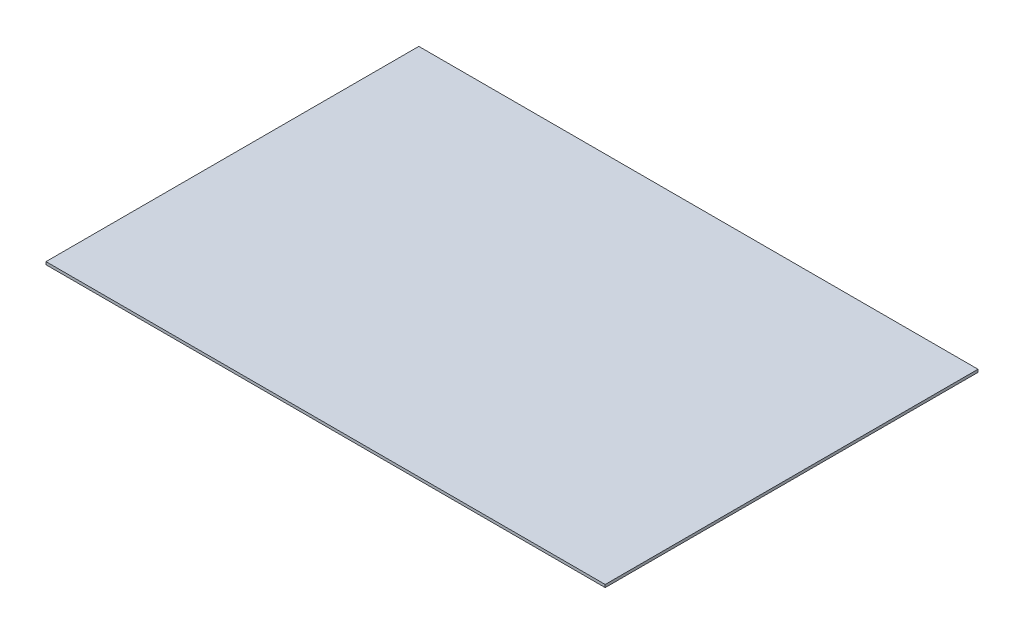
ISO-10303-21;
HEADER;
FILE_DESCRIPTION(('STEP AP214'),'2;1');
FILE_NAME('part.step','',(''),(''),'','','');
FILE_SCHEMA(('AUTOMOTIVE_DESIGN { 1 0 10303 214 1 1 1 1 }'));
ENDSEC;
DATA;
#1=APPLICATION_CONTEXT('core data for automotive mechanical design processes');
#2=APPLICATION_PROTOCOL_DEFINITION('international standard','automotive_design',2000,#1);
#3=PRODUCT_CONTEXT('',#1,'mechanical');
#4=PRODUCT('Part','Part','',(#3));
#5=PRODUCT_RELATED_PRODUCT_CATEGORY('part','',(#4));
#6=PRODUCT_DEFINITION_FORMATION('','',#4);
#7=PRODUCT_DEFINITION_CONTEXT('part definition',#1,'design');
#8=PRODUCT_DEFINITION('design','',#6,#7);
#9=PRODUCT_DEFINITION_SHAPE('','',#8);
#10=(LENGTH_UNIT() NAMED_UNIT(*) SI_UNIT(.MILLI.,.METRE.));
#11=(NAMED_UNIT(*) PLANE_ANGLE_UNIT() SI_UNIT($,.RADIAN.));
#12=(NAMED_UNIT(*) SI_UNIT($,.STERADIAN.) SOLID_ANGLE_UNIT());
#13=UNCERTAINTY_MEASURE_WITH_UNIT(LENGTH_MEASURE(1.E-05),#10,'distance_accuracy_value','');
#14=(GEOMETRIC_REPRESENTATION_CONTEXT(3) GLOBAL_UNCERTAINTY_ASSIGNED_CONTEXT((#13)) GLOBAL_UNIT_ASSIGNED_CONTEXT((#10,
#11,#12)) REPRESENTATION_CONTEXT('',''));
#15=CARTESIAN_POINT('',(0.,0.,0.));
#16=DIRECTION('',(0.,0.,1.));
#17=DIRECTION('',(1.,0.,0.));
#18=AXIS2_PLACEMENT_3D('',#15,#16,#17);
#19=CARTESIAN_POINT('',(152.4,1.5,101.6));
#20=DIRECTION('',(-1.,0.,0.));
#21=DIRECTION('',(0.,0.,1.));
#22=AXIS2_PLACEMENT_3D('',#19,#20,#21);
#23=PLANE('',#22);
#24=DIRECTION('',(0.,0.,-1.));
#25=VECTOR('',#24,1.);
#26=CARTESIAN_POINT('',(152.4,0.,101.6));
#27=LINE('',#26,#25);
#28=CARTESIAN_POINT('',(152.4,0.,101.6));
#29=VERTEX_POINT('',#28);
#30=CARTESIAN_POINT('',(152.4,0.,-101.6));
#31=VERTEX_POINT('',#30);
#32=EDGE_CURVE('E98',#29,#31,#27,.T.);
#33=ORIENTED_EDGE('',*,*,#32,.T.);
#34=DIRECTION('',(0.,-1.,0.));
#35=VECTOR('',#34,1.);
#36=CARTESIAN_POINT('',(152.4,1.5,-101.6));
#37=LINE('',#36,#35);
#38=CARTESIAN_POINT('',(152.4,1.5,-101.6));
#39=VERTEX_POINT('',#38);
#40=EDGE_CURVE('E11',#39,#31,#37,.T.);
#41=ORIENTED_EDGE('',*,*,#40,.F.);
#42=DIRECTION('',(0.,0.,-1.));
#43=VECTOR('',#42,1.);
#44=CARTESIAN_POINT('',(152.4,1.5,101.6));
#45=LINE('',#44,#43);
#46=CARTESIAN_POINT('',(152.4,1.5,101.6));
#47=VERTEX_POINT('',#46);
#48=EDGE_CURVE('E86',#47,#39,#45,.T.);
#49=ORIENTED_EDGE('',*,*,#48,.F.);
#50=DIRECTION('',(0.,-1.,0.));
#51=VECTOR('',#50,1.);
#52=CARTESIAN_POINT('',(152.4,1.5,101.6));
#53=LINE('',#52,#51);
#54=EDGE_CURVE('E94',#47,#29,#53,.T.);
#55=ORIENTED_EDGE('',*,*,#54,.T.);
#56=EDGE_LOOP('',(#33,#41,#49,#55));
#57=FACE_BOUND('',#56,.T.);
#58=ADVANCED_FACE('F35',(#57),#23,.F.);
#59=CARTESIAN_POINT('',(-152.4,1.5,-101.6));
#60=DIRECTION('',(0.,0.,1.));
#61=DIRECTION('',(1.,0.,0.));
#62=AXIS2_PLACEMENT_3D('',#59,#60,#61);
#63=PLANE('',#62);
#64=DIRECTION('',(-1.,0.,0.));
#65=VECTOR('',#64,1.);
#66=CARTESIAN_POINT('',(-152.4,0.,-101.6));
#67=LINE('',#66,#65);
#68=CARTESIAN_POINT('',(-152.4,0.,-101.6));
#69=VERTEX_POINT('',#68);
#70=EDGE_CURVE('E90',#31,#69,#67,.T.);
#71=ORIENTED_EDGE('',*,*,#70,.T.);
#72=DIRECTION('',(0.,-1.,0.));
#73=VECTOR('',#72,1.);
#74=CARTESIAN_POINT('',(-152.4,1.5,-101.6));
#75=LINE('',#74,#73);
#76=CARTESIAN_POINT('',(-152.4,1.5,-101.6));
#77=VERTEX_POINT('',#76);
#78=EDGE_CURVE('E43',#77,#69,#75,.T.);
#79=ORIENTED_EDGE('',*,*,#78,.F.);
#80=DIRECTION('',(-1.,0.,0.));
#81=VECTOR('',#80,1.);
#82=CARTESIAN_POINT('',(-152.4,1.5,-101.6));
#83=LINE('',#82,#81);
#84=EDGE_CURVE('E81',#39,#77,#83,.T.);
#85=ORIENTED_EDGE('',*,*,#84,.F.);
#86=ORIENTED_EDGE('',*,*,#40,.T.);
#87=EDGE_LOOP('',(#71,#79,#85,#86));
#88=FACE_BOUND('',#87,.T.);
#89=ADVANCED_FACE('F89',(#88),#63,.F.);
#90=CARTESIAN_POINT('',(-152.4,1.5,101.6));
#91=DIRECTION('',(1.,0.,0.));
#92=DIRECTION('',(0.,0.,-1.));
#93=AXIS2_PLACEMENT_3D('',#90,#91,#92);
#94=PLANE('',#93);
#95=DIRECTION('',(0.,0.,1.));
#96=VECTOR('',#95,1.);
#97=CARTESIAN_POINT('',(-152.4,0.,101.6));
#98=LINE('',#97,#96);
#99=CARTESIAN_POINT('',(-152.4,0.,101.6));
#100=VERTEX_POINT('',#99);
#101=EDGE_CURVE('E68',#69,#100,#98,.T.);
#102=ORIENTED_EDGE('',*,*,#101,.T.);
#103=DIRECTION('',(0.,-1.,0.));
#104=VECTOR('',#103,1.);
#105=CARTESIAN_POINT('',(-152.4,1.5,101.6));
#106=LINE('',#105,#104);
#107=CARTESIAN_POINT('',(-152.4,1.5,101.6));
#108=VERTEX_POINT('',#107);
#109=EDGE_CURVE('E91',#108,#100,#106,.T.);
#110=ORIENTED_EDGE('',*,*,#109,.F.);
#111=DIRECTION('',(0.,0.,1.));
#112=VECTOR('',#111,1.);
#113=CARTESIAN_POINT('',(-152.4,1.5,101.6));
#114=LINE('',#113,#112);
#115=EDGE_CURVE('E84',#77,#108,#114,.T.);
#116=ORIENTED_EDGE('',*,*,#115,.F.);
#117=ORIENTED_EDGE('',*,*,#78,.T.);
#118=EDGE_LOOP('',(#102,#110,#116,#117));
#119=FACE_BOUND('',#118,.T.);
#120=ADVANCED_FACE('F92',(#119),#94,.F.);
#121=CARTESIAN_POINT('',(-152.4,1.5,101.6));
#122=DIRECTION('',(0.,0.,-1.));
#123=DIRECTION('',(-1.,0.,0.));
#124=AXIS2_PLACEMENT_3D('',#121,#122,#123);
#125=PLANE('',#124);
#126=DIRECTION('',(1.,0.,0.));
#127=VECTOR('',#126,1.);
#128=CARTESIAN_POINT('',(-152.4,0.,101.6));
#129=LINE('',#128,#127);
#130=EDGE_CURVE('E74',#100,#29,#129,.T.);
#131=ORIENTED_EDGE('',*,*,#130,.T.);
#132=ORIENTED_EDGE('',*,*,#54,.F.);
#133=DIRECTION('',(1.,0.,0.));
#134=VECTOR('',#133,1.);
#135=CARTESIAN_POINT('',(-152.4,1.5,101.6));
#136=LINE('',#135,#134);
#137=EDGE_CURVE('E51',#108,#47,#136,.T.);
#138=ORIENTED_EDGE('',*,*,#137,.F.);
#139=ORIENTED_EDGE('',*,*,#109,.T.);
#140=EDGE_LOOP('',(#131,#132,#138,#139));
#141=FACE_BOUND('',#140,.T.);
#142=ADVANCED_FACE('F105',(#141),#125,.F.);
#143=CARTESIAN_POINT('',(0.,1.5,0.));
#144=DIRECTION('',(0.,-1.,0.));
#145=DIRECTION('',(0.,0.,-1.));
#146=AXIS2_PLACEMENT_3D('',#143,#144,#145);
#147=PLANE('',#146);
#148=ORIENTED_EDGE('',*,*,#48,.T.);
#149=ORIENTED_EDGE('',*,*,#84,.T.);
#150=ORIENTED_EDGE('',*,*,#115,.T.);
#151=ORIENTED_EDGE('',*,*,#137,.T.);
#152=EDGE_LOOP('',(#148,#149,#150,#151));
#153=FACE_BOUND('',#152,.T.);
#154=ADVANCED_FACE('F82',(#153),#147,.F.);
#155=CARTESIAN_POINT('',(0.,0.,0.));
#156=DIRECTION('',(0.,-1.,0.));
#157=DIRECTION('',(0.,0.,-1.));
#158=AXIS2_PLACEMENT_3D('',#155,#156,#157);
#159=PLANE('',#158);
#160=ORIENTED_EDGE('',*,*,#32,.F.);
#161=ORIENTED_EDGE('',*,*,#130,.F.);
#162=ORIENTED_EDGE('',*,*,#101,.F.);
#163=ORIENTED_EDGE('',*,*,#70,.F.);
#164=EDGE_LOOP('',(#160,#161,#162,#163));
#165=FACE_BOUND('',#164,.T.);
#166=ADVANCED_FACE('F108',(#165),#159,.T.);
#167=CLOSED_SHELL('',(#58,#89,#120,#142,#154,#166));
#168=MANIFOLD_SOLID_BREP('B2',#167);
#169=ADVANCED_BREP_SHAPE_REPRESENTATION('',(#18,#168),#14);
#170=SHAPE_DEFINITION_REPRESENTATION(#9,#169);
ENDSEC;
END-ISO-10303-21;
